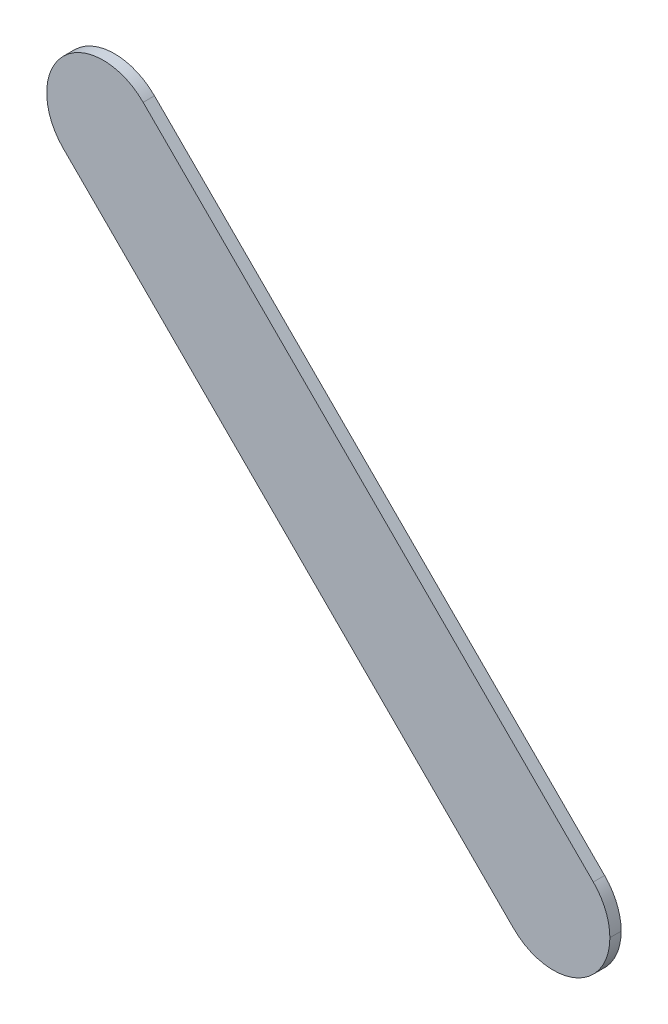
ISO-10303-21;
HEADER;
FILE_DESCRIPTION(('STEP AP214'),'2;1');
FILE_NAME('part.step','',(''),(''),'','','');
FILE_SCHEMA(('AUTOMOTIVE_DESIGN { 1 0 10303 214 1 1 1 1 }'));
ENDSEC;
DATA;
#1=APPLICATION_CONTEXT('core data for automotive mechanical design processes');
#2=APPLICATION_PROTOCOL_DEFINITION('international standard','automotive_design',2000,#1);
#3=PRODUCT_CONTEXT('',#1,'mechanical');
#4=PRODUCT('Part','Part','',(#3));
#5=PRODUCT_RELATED_PRODUCT_CATEGORY('part','',(#4));
#6=PRODUCT_DEFINITION_FORMATION('','',#4);
#7=PRODUCT_DEFINITION_CONTEXT('part definition',#1,'design');
#8=PRODUCT_DEFINITION('design','',#6,#7);
#9=PRODUCT_DEFINITION_SHAPE('','',#8);
#10=(LENGTH_UNIT() NAMED_UNIT(*) SI_UNIT(.MILLI.,.METRE.));
#11=(NAMED_UNIT(*) PLANE_ANGLE_UNIT() SI_UNIT($,.RADIAN.));
#12=(NAMED_UNIT(*) SI_UNIT($,.STERADIAN.) SOLID_ANGLE_UNIT());
#13=UNCERTAINTY_MEASURE_WITH_UNIT(LENGTH_MEASURE(1.E-05),#10,'distance_accuracy_value','');
#14=(GEOMETRIC_REPRESENTATION_CONTEXT(3) GLOBAL_UNCERTAINTY_ASSIGNED_CONTEXT((#13)) GLOBAL_UNIT_ASSIGNED_CONTEXT((#10,
#11,#12)) REPRESENTATION_CONTEXT('',''));
#15=CARTESIAN_POINT('',(0.,0.,0.));
#16=DIRECTION('',(0.,0.,1.));
#17=DIRECTION('',(1.,0.,0.));
#18=AXIS2_PLACEMENT_3D('',#15,#16,#17);
#19=CARTESIAN_POINT('',(24.640499267578,25.627999267578,1.1723000001));
#20=DIRECTION('',(0.,0.,1.));
#21=DIRECTION('',(1.,0.,0.));
#22=AXIS2_PLACEMENT_3D('',#19,#20,#21);
#23=PLANE('',#22);
#24=CARTESIAN_POINT('',(24.893499755859,25.374998779297,1.1723000001));
#25=DIRECTION('',(0.,0.,-1.));
#26=DIRECTION('',(1.,0.,0.));
#27=AXIS2_PLACEMENT_3D('',#24,#25,#26);
#28=CIRCLE('',#27,0.06349977717867);
#29=CARTESIAN_POINT('',(24.938400878906,25.419899902344,1.1723000001));
#30=VERTEX_POINT('',#29);
#31=CARTESIAN_POINT('',(24.956999533038,25.374998779297,1.1723000001));
#32=VERTEX_POINT('',#31);
#33=EDGE_CURVE('E20',#30,#32,#28,.T.);
#34=ORIENTED_EDGE('',*,*,#33,.F.);
#35=DIRECTION('',(-0.707106781186548,0.707106781186548,0.));
#36=VECTOR('',#35,1.);
#37=CARTESIAN_POINT('',(24.432399902344,25.925900878906,1.1723000001));
#38=LINE('',#37,#36);
#39=CARTESIAN_POINT('',(24.432399902344,25.925900878906,1.1723000001));
#40=VERTEX_POINT('',#39);
#41=EDGE_CURVE('E104',#30,#40,#38,.T.);
#42=ORIENTED_EDGE('',*,*,#41,.T.);
#43=CARTESIAN_POINT('',(24.387498779297,25.880999755859,1.1723000001));
#44=DIRECTION('',(0.,0.,-1.));
#45=DIRECTION('',(1.,0.,0.));
#46=AXIS2_PLACEMENT_3D('',#43,#44,#45);
#47=CIRCLE('',#46,0.06349977717867);
#48=CARTESIAN_POINT('',(24.34259765625,25.836098632813,1.1723000001));
#49=VERTEX_POINT('',#48);
#50=EDGE_CURVE('E103',#49,#40,#47,.T.);
#51=ORIENTED_EDGE('',*,*,#50,.F.);
#52=DIRECTION('',(0.707106781186548,-0.707106781186548,0.));
#53=VECTOR('',#52,1.);
#54=CARTESIAN_POINT('',(24.848598632813,25.33009765625,1.1723000001));
#55=LINE('',#54,#53);
#56=CARTESIAN_POINT('',(24.848598632813,25.33009765625,1.1723000001));
#57=VERTEX_POINT('',#56);
#58=EDGE_CURVE('E11',#49,#57,#55,.T.);
#59=ORIENTED_EDGE('',*,*,#58,.T.);
#60=CARTESIAN_POINT('',(24.893499755859,25.374998779297,1.1723000001));
#61=DIRECTION('',(0.,0.,-1.));
#62=DIRECTION('',(1.,0.,0.));
#63=AXIS2_PLACEMENT_3D('',#60,#61,#62);
#64=CIRCLE('',#63,0.06349977717867);
#65=EDGE_CURVE('E121',#32,#57,#64,.T.);
#66=ORIENTED_EDGE('',*,*,#65,.F.);
#67=EDGE_LOOP('',(#34,#42,#51,#59,#66));
#68=FACE_BOUND('',#67,.T.);
#69=ADVANCED_FACE('F17',(#68),#23,.T.);
#70=CARTESIAN_POINT('',(24.848598632813,25.33009765625,1.1596000001));
#71=DIRECTION('',(0.707106781186548,0.707106781186548,0.));
#72=DIRECTION('',(0.,0.,-1.));
#73=AXIS2_PLACEMENT_3D('',#70,#71,#72);
#74=PLANE('',#73);
#75=DIRECTION('',(0.,0.,1.));
#76=VECTOR('',#75,1.);
#77=CARTESIAN_POINT('',(24.34259765625,25.836098632813,1.1596000001));
#78=LINE('',#77,#76);
#79=CARTESIAN_POINT('',(24.34259765625,25.836098632813,1.1596000001));
#80=VERTEX_POINT('',#79);
#81=EDGE_CURVE('E97',#80,#49,#78,.T.);
#82=ORIENTED_EDGE('',*,*,#81,.F.);
#83=DIRECTION('',(0.707106781186548,-0.707106781186548,0.));
#84=VECTOR('',#83,1.);
#85=CARTESIAN_POINT('',(24.34259765625,25.836098632812,1.1596000001));
#86=LINE('',#85,#84);
#87=CARTESIAN_POINT('',(24.848598632813,25.33009765625,1.1596000001));
#88=VERTEX_POINT('',#87);
#89=EDGE_CURVE('E56',#80,#88,#86,.T.);
#90=ORIENTED_EDGE('',*,*,#89,.T.);
#91=DIRECTION('',(0.,0.,-1.));
#92=VECTOR('',#91,1.);
#93=CARTESIAN_POINT('',(24.848598632813,25.33009765625,1.1596000001));
#94=LINE('',#93,#92);
#95=EDGE_CURVE('E101',#57,#88,#94,.T.);
#96=ORIENTED_EDGE('',*,*,#95,.F.);
#97=ORIENTED_EDGE('',*,*,#58,.F.);
#98=EDGE_LOOP('',(#82,#90,#96,#97));
#99=FACE_BOUND('',#98,.T.);
#100=ADVANCED_FACE('F100',(#99),#74,.F.);
#101=CARTESIAN_POINT('',(24.893499755859,25.374998779297,1.1596000001));
#102=DIRECTION('',(0.,0.,1.));
#103=DIRECTION('',(1.,0.,0.));
#104=AXIS2_PLACEMENT_3D('',#101,#102,#103);
#105=CYLINDRICAL_SURFACE('',#104,0.06349977717867);
#106=DIRECTION('',(0.,0.,1.));
#107=VECTOR('',#106,1.);
#108=CARTESIAN_POINT('',(24.956999533038,25.374998779297,1.1596000001));
#109=LINE('',#108,#107);
#110=CARTESIAN_POINT('',(24.956999533038,25.374998779297,1.1596000001));
#111=VERTEX_POINT('',#110);
#112=EDGE_CURVE('E126',#111,#32,#109,.T.);
#113=ORIENTED_EDGE('',*,*,#112,.F.);
#114=CARTESIAN_POINT('',(24.893499755859,25.374998779297,1.1596000001));
#115=DIRECTION('',(0.,0.,1.));
#116=DIRECTION('',(1.,0.,0.));
#117=AXIS2_PLACEMENT_3D('',#114,#115,#116);
#118=CIRCLE('',#117,0.06349977717867);
#119=CARTESIAN_POINT('',(24.938400878906,25.419899902344,1.1596000001));
#120=VERTEX_POINT('',#119);
#121=EDGE_CURVE('E67',#111,#120,#118,.T.);
#122=ORIENTED_EDGE('',*,*,#121,.T.);
#123=DIRECTION('',(0.,0.,1.));
#124=VECTOR('',#123,1.);
#125=CARTESIAN_POINT('',(24.938400878906,25.419899902344,1.1596000001));
#126=LINE('',#125,#124);
#127=EDGE_CURVE('E81',#120,#30,#126,.T.);
#128=ORIENTED_EDGE('',*,*,#127,.T.);
#129=ORIENTED_EDGE('',*,*,#33,.T.);
#130=EDGE_LOOP('',(#113,#122,#128,#129));
#131=FACE_BOUND('',#130,.T.);
#132=ADVANCED_FACE('F145',(#131),#105,.T.);
#133=CARTESIAN_POINT('',(24.432399902344,25.925900878906,1.1596000001));
#134=DIRECTION('',(-0.707106781186548,-0.707106781186548,0.));
#135=DIRECTION('',(-0.707106781186548,0.707106781186548,0.));
#136=AXIS2_PLACEMENT_3D('',#133,#134,#135);
#137=PLANE('',#136);
#138=ORIENTED_EDGE('',*,*,#127,.F.);
#139=DIRECTION('',(-0.707106781186548,0.707106781186548,0.));
#140=VECTOR('',#139,1.);
#141=CARTESIAN_POINT('',(24.938400878906,25.419899902344,1.1596000001));
#142=LINE('',#141,#140);
#143=CARTESIAN_POINT('',(24.432399902344,25.925900878906,1.1596000001));
#144=VERTEX_POINT('',#143);
#145=EDGE_CURVE('E120',#120,#144,#142,.T.);
#146=ORIENTED_EDGE('',*,*,#145,.T.);
#147=DIRECTION('',(0.,0.,-1.));
#148=VECTOR('',#147,1.);
#149=CARTESIAN_POINT('',(24.432399902344,25.925900878906,1.1596000001));
#150=LINE('',#149,#148);
#151=EDGE_CURVE('E90',#40,#144,#150,.T.);
#152=ORIENTED_EDGE('',*,*,#151,.F.);
#153=ORIENTED_EDGE('',*,*,#41,.F.);
#154=EDGE_LOOP('',(#138,#146,#152,#153));
#155=FACE_BOUND('',#154,.T.);
#156=ADVANCED_FACE('F167',(#155),#137,.F.);
#157=CARTESIAN_POINT('',(24.387498779297,25.880999755859,1.1596000001));
#158=DIRECTION('',(0.,0.,1.));
#159=DIRECTION('',(1.,0.,0.));
#160=AXIS2_PLACEMENT_3D('',#157,#158,#159);
#161=CYLINDRICAL_SURFACE('',#160,0.06349977717867);
#162=CARTESIAN_POINT('',(24.387498779297,25.880999755859,1.1596000001));
#163=DIRECTION('',(0.,0.,1.));
#164=DIRECTION('',(1.,0.,0.));
#165=AXIS2_PLACEMENT_3D('',#162,#163,#164);
#166=CIRCLE('',#165,0.06349977717867);
#167=EDGE_CURVE('E107',#144,#80,#166,.T.);
#168=ORIENTED_EDGE('',*,*,#167,.T.);
#169=ORIENTED_EDGE('',*,*,#81,.T.);
#170=ORIENTED_EDGE('',*,*,#50,.T.);
#171=ORIENTED_EDGE('',*,*,#151,.T.);
#172=EDGE_LOOP('',(#168,#169,#170,#171));
#173=FACE_BOUND('',#172,.T.);
#174=ADVANCED_FACE('F106',(#173),#161,.T.);
#175=CARTESIAN_POINT('',(24.640499267578,25.627999267578,1.1596000001));
#176=DIRECTION('',(0.,0.,1.));
#177=DIRECTION('',(1.,0.,0.));
#178=AXIS2_PLACEMENT_3D('',#175,#176,#177);
#179=PLANE('',#178);
#180=ORIENTED_EDGE('',*,*,#145,.F.);
#181=ORIENTED_EDGE('',*,*,#121,.F.);
#182=CARTESIAN_POINT('',(24.893499755859,25.374998779297,1.1596000001));
#183=DIRECTION('',(0.,0.,1.));
#184=DIRECTION('',(1.,0.,0.));
#185=AXIS2_PLACEMENT_3D('',#182,#183,#184);
#186=CIRCLE('',#185,0.06349977717867);
#187=EDGE_CURVE('E132',#88,#111,#186,.T.);
#188=ORIENTED_EDGE('',*,*,#187,.F.);
#189=ORIENTED_EDGE('',*,*,#89,.F.);
#190=ORIENTED_EDGE('',*,*,#167,.F.);
#191=EDGE_LOOP('',(#180,#181,#188,#189,#190));
#192=FACE_BOUND('',#191,.T.);
#193=ADVANCED_FACE('F146',(#192),#179,.F.);
#194=CARTESIAN_POINT('',(24.893499755859,25.374998779297,1.1596000001));
#195=DIRECTION('',(0.,0.,1.));
#196=DIRECTION('',(1.,0.,0.));
#197=AXIS2_PLACEMENT_3D('',#194,#195,#196);
#198=CYLINDRICAL_SURFACE('',#197,0.06349977717867);
#199=ORIENTED_EDGE('',*,*,#187,.T.);
#200=ORIENTED_EDGE('',*,*,#112,.T.);
#201=ORIENTED_EDGE('',*,*,#65,.T.);
#202=ORIENTED_EDGE('',*,*,#95,.T.);
#203=EDGE_LOOP('',(#199,#200,#201,#202));
#204=FACE_BOUND('',#203,.T.);
#205=ADVANCED_FACE('F148',(#204),#198,.T.);
#206=CLOSED_SHELL('',(#69,#100,#132,#156,#174,#193,#205));
#207=MANIFOLD_SOLID_BREP('B1',#206);
#208=ADVANCED_BREP_SHAPE_REPRESENTATION('',(#18,#207),#14);
#209=SHAPE_DEFINITION_REPRESENTATION(#9,#208);
ENDSEC;
END-ISO-10303-21;
